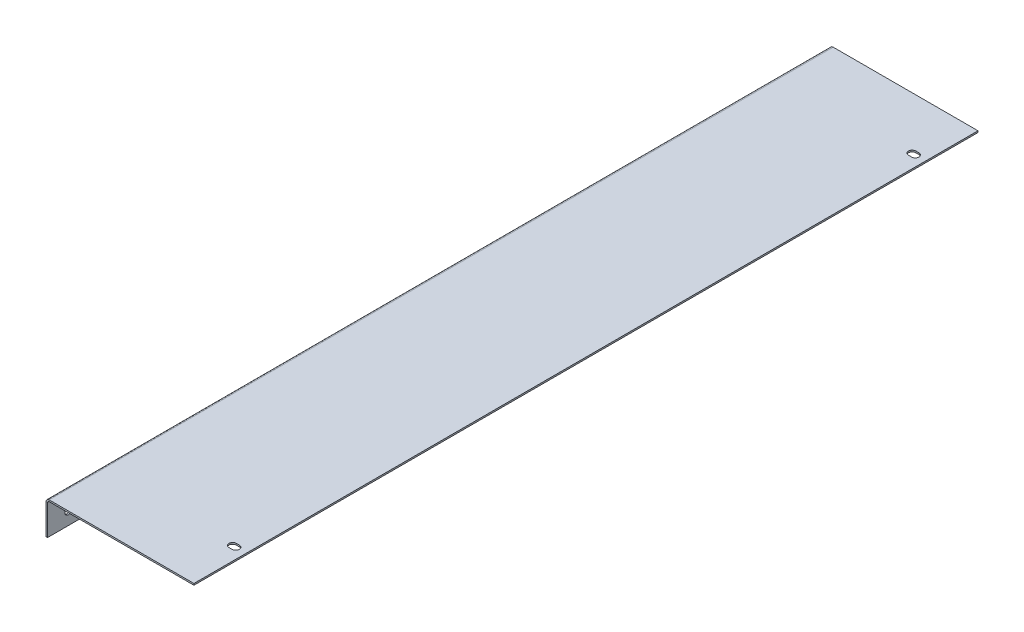
ISO-10303-21;
HEADER;
FILE_DESCRIPTION(('STEP AP214'),'2;1');
FILE_NAME('part.step','',(''),(''),'','','');
FILE_SCHEMA(('AUTOMOTIVE_DESIGN { 1 0 10303 214 1 1 1 1 }'));
ENDSEC;
DATA;
#1=APPLICATION_CONTEXT('core data for automotive mechanical design processes');
#2=APPLICATION_PROTOCOL_DEFINITION('international standard','automotive_design',2000,#1);
#3=PRODUCT_CONTEXT('',#1,'mechanical');
#4=PRODUCT('Part','Part','',(#3));
#5=PRODUCT_RELATED_PRODUCT_CATEGORY('part','',(#4));
#6=PRODUCT_DEFINITION_FORMATION('','',#4);
#7=PRODUCT_DEFINITION_CONTEXT('part definition',#1,'design');
#8=PRODUCT_DEFINITION('design','',#6,#7);
#9=PRODUCT_DEFINITION_SHAPE('','',#8);
#10=(LENGTH_UNIT() NAMED_UNIT(*) SI_UNIT(.MILLI.,.METRE.));
#11=(NAMED_UNIT(*) PLANE_ANGLE_UNIT() SI_UNIT($,.RADIAN.));
#12=(NAMED_UNIT(*) SI_UNIT($,.STERADIAN.) SOLID_ANGLE_UNIT());
#13=UNCERTAINTY_MEASURE_WITH_UNIT(LENGTH_MEASURE(1.E-05),#10,'distance_accuracy_value','');
#14=(GEOMETRIC_REPRESENTATION_CONTEXT(3) GLOBAL_UNCERTAINTY_ASSIGNED_CONTEXT((#13)) GLOBAL_UNIT_ASSIGNED_CONTEXT((#10,
#11,#12)) REPRESENTATION_CONTEXT('',''));
#15=CARTESIAN_POINT('',(0.,0.,0.));
#16=DIRECTION('',(0.,0.,1.));
#17=DIRECTION('',(1.,0.,0.));
#18=AXIS2_PLACEMENT_3D('',#15,#16,#17);
#19=CARTESIAN_POINT('',(0.,-1.5,375.));
#20=DIRECTION('',(0.,1.,0.));
#21=DIRECTION('',(0.,0.,1.));
#22=AXIS2_PLACEMENT_3D('',#19,#20,#21);
#23=PLANE('',#22);
#24=DIRECTION('',(1.,0.,0.));
#25=VECTOR('',#24,1.);
#26=CARTESIAN_POINT('',(0.,-1.5,-375.));
#27=LINE('',#26,#25);
#28=CARTESIAN_POINT('',(3.,-1.5,-375.));
#29=VERTEX_POINT('',#28);
#30=CARTESIAN_POINT('',(141.5,-1.5,-375.));
#31=VERTEX_POINT('',#30);
#32=EDGE_CURVE('E231',#29,#31,#27,.T.);
#33=ORIENTED_EDGE('',*,*,#32,.T.);
#34=DIRECTION('',(0.,0.,-1.));
#35=VECTOR('',#34,1.);
#36=CARTESIAN_POINT('',(141.5,-1.5,375.));
#37=LINE('',#36,#35);
#38=CARTESIAN_POINT('',(141.5,-1.5,375.));
#39=VERTEX_POINT('',#38);
#40=EDGE_CURVE('E298',#39,#31,#37,.T.);
#41=ORIENTED_EDGE('',*,*,#40,.F.);
#42=DIRECTION('',(1.,0.,0.));
#43=VECTOR('',#42,1.);
#44=CARTESIAN_POINT('',(0.,-1.5,375.));
#45=LINE('',#44,#43);
#46=CARTESIAN_POINT('',(3.,-1.5,375.));
#47=VERTEX_POINT('',#46);
#48=EDGE_CURVE('E234',#47,#39,#45,.T.);
#49=ORIENTED_EDGE('',*,*,#48,.F.);
#50=DIRECTION('',(0.,0.,-1.));
#51=VECTOR('',#50,1.);
#52=CARTESIAN_POINT('',(3.,-1.5,375.));
#53=LINE('',#52,#51);
#54=EDGE_CURVE('E258',#47,#29,#53,.T.);
#55=ORIENTED_EDGE('',*,*,#54,.T.);
#56=EDGE_LOOP('',(#33,#41,#49,#55));
#57=FACE_BOUND('',#56,.T.);
#58=DIRECTION('',(1.,0.,0.));
#59=VECTOR('',#58,1.);
#60=CARTESIAN_POINT('',(131.5,-1.5,328.5));
#61=LINE('',#60,#59);
#62=CARTESIAN_POINT('',(128.5,-1.5,328.5));
#63=VERTEX_POINT('',#62);
#64=CARTESIAN_POINT('',(131.5,-1.5,328.5));
#65=VERTEX_POINT('',#64);
#66=EDGE_CURVE('E206',#63,#65,#61,.T.);
#67=ORIENTED_EDGE('',*,*,#66,.T.);
#68=CARTESIAN_POINT('',(131.5,-1.5,325.));
#69=DIRECTION('',(0.,1.,0.));
#70=DIRECTION('',(0.,0.,1.));
#71=AXIS2_PLACEMENT_3D('',#68,#69,#70);
#72=CIRCLE('',#71,3.5);
#73=CARTESIAN_POINT('',(131.5,-1.5,321.5));
#74=VERTEX_POINT('',#73);
#75=EDGE_CURVE('E196',#65,#74,#72,.T.);
#76=ORIENTED_EDGE('',*,*,#75,.T.);
#77=DIRECTION('',(-1.,0.,0.));
#78=VECTOR('',#77,1.);
#79=CARTESIAN_POINT('',(131.5,-1.5,321.5));
#80=LINE('',#79,#78);
#81=CARTESIAN_POINT('',(128.5,-1.5,321.5));
#82=VERTEX_POINT('',#81);
#83=EDGE_CURVE('E199',#74,#82,#80,.T.);
#84=ORIENTED_EDGE('',*,*,#83,.T.);
#85=CARTESIAN_POINT('',(128.5,-1.5,325.));
#86=DIRECTION('',(0.,1.,0.));
#87=DIRECTION('',(0.,0.,1.));
#88=AXIS2_PLACEMENT_3D('',#85,#86,#87);
#89=CIRCLE('',#88,3.5);
#90=EDGE_CURVE('E203',#82,#63,#89,.T.);
#91=ORIENTED_EDGE('',*,*,#90,.T.);
#92=EDGE_LOOP('',(#67,#76,#84,#91));
#93=FACE_BOUND('',#92,.T.);
#94=CARTESIAN_POINT('',(131.5,-1.5,-325.));
#95=DIRECTION('',(0.,-1.,0.));
#96=DIRECTION('',(0.,0.,-1.));
#97=AXIS2_PLACEMENT_3D('',#94,#95,#96);
#98=CIRCLE('',#97,3.5);
#99=CARTESIAN_POINT('',(131.5,-1.5,-328.5));
#100=VERTEX_POINT('',#99);
#101=CARTESIAN_POINT('',(131.5,-1.5,-321.5));
#102=VERTEX_POINT('',#101);
#103=EDGE_CURVE('E164',#100,#102,#98,.T.);
#104=ORIENTED_EDGE('',*,*,#103,.F.);
#105=DIRECTION('',(1.,0.,0.));
#106=VECTOR('',#105,1.);
#107=CARTESIAN_POINT('',(131.5,-1.5,-328.5));
#108=LINE('',#107,#106);
#109=CARTESIAN_POINT('',(128.5,-1.5,-328.5));
#110=VERTEX_POINT('',#109);
#111=EDGE_CURVE('E156',#110,#100,#108,.T.);
#112=ORIENTED_EDGE('',*,*,#111,.F.);
#113=CARTESIAN_POINT('',(128.5,-1.5,-325.));
#114=DIRECTION('',(0.,-1.,0.));
#115=DIRECTION('',(0.,0.,-1.));
#116=AXIS2_PLACEMENT_3D('',#113,#114,#115);
#117=CIRCLE('',#116,3.5);
#118=CARTESIAN_POINT('',(128.5,-1.5,-321.5));
#119=VERTEX_POINT('',#118);
#120=EDGE_CURVE('E163',#119,#110,#117,.T.);
#121=ORIENTED_EDGE('',*,*,#120,.F.);
#122=DIRECTION('',(-1.,0.,0.));
#123=VECTOR('',#122,1.);
#124=CARTESIAN_POINT('',(131.5,-1.5,-321.5));
#125=LINE('',#124,#123);
#126=EDGE_CURVE('E168',#102,#119,#125,.T.);
#127=ORIENTED_EDGE('',*,*,#126,.F.);
#128=EDGE_LOOP('',(#104,#112,#121,#127));
#129=FACE_BOUND('',#128,.T.);
#130=ADVANCED_FACE('F44',(#57,#93,#129),#23,.F.);
#131=CARTESIAN_POINT('',(0.,0.,375.));
#132=DIRECTION('',(0.,1.,0.));
#133=DIRECTION('',(0.,0.,1.));
#134=AXIS2_PLACEMENT_3D('',#131,#132,#133);
#135=PLANE('',#134);
#136=CARTESIAN_POINT('',(131.5,0.,325.));
#137=DIRECTION('',(0.,1.,0.));
#138=DIRECTION('',(0.,0.,1.));
#139=AXIS2_PLACEMENT_3D('',#136,#137,#138);
#140=CIRCLE('',#139,3.5);
#141=CARTESIAN_POINT('',(131.5,0.,328.5));
#142=VERTEX_POINT('',#141);
#143=CARTESIAN_POINT('',(131.5,0.,321.5));
#144=VERTEX_POINT('',#143);
#145=EDGE_CURVE('E193',#142,#144,#140,.T.);
#146=ORIENTED_EDGE('',*,*,#145,.F.);
#147=DIRECTION('',(1.,0.,0.));
#148=VECTOR('',#147,1.);
#149=CARTESIAN_POINT('',(131.5,0.,328.5));
#150=LINE('',#149,#148);
#151=CARTESIAN_POINT('',(128.5,0.,328.5));
#152=VERTEX_POINT('',#151);
#153=EDGE_CURVE('E200',#152,#142,#150,.T.);
#154=ORIENTED_EDGE('',*,*,#153,.F.);
#155=CARTESIAN_POINT('',(128.5,0.,325.));
#156=DIRECTION('',(0.,1.,0.));
#157=DIRECTION('',(0.,0.,1.));
#158=AXIS2_PLACEMENT_3D('',#155,#156,#157);
#159=CIRCLE('',#158,3.5);
#160=CARTESIAN_POINT('',(128.5,0.,321.5));
#161=VERTEX_POINT('',#160);
#162=EDGE_CURVE('E214',#161,#152,#159,.T.);
#163=ORIENTED_EDGE('',*,*,#162,.F.);
#164=DIRECTION('',(-1.,0.,0.));
#165=VECTOR('',#164,1.);
#166=CARTESIAN_POINT('',(131.5,0.,321.5));
#167=LINE('',#166,#165);
#168=EDGE_CURVE('E211',#144,#161,#167,.T.);
#169=ORIENTED_EDGE('',*,*,#168,.F.);
#170=EDGE_LOOP('',(#146,#154,#163,#169));
#171=FACE_BOUND('',#170,.T.);
#172=DIRECTION('',(1.,0.,0.));
#173=VECTOR('',#172,1.);
#174=CARTESIAN_POINT('',(0.,0.,-375.));
#175=LINE('',#174,#173);
#176=CARTESIAN_POINT('',(3.,0.,-375.));
#177=VERTEX_POINT('',#176);
#178=CARTESIAN_POINT('',(141.5,0.,-375.));
#179=VERTEX_POINT('',#178);
#180=EDGE_CURVE('E264',#177,#179,#175,.T.);
#181=ORIENTED_EDGE('',*,*,#180,.F.);
#182=DIRECTION('',(0.,0.,-1.));
#183=VECTOR('',#182,1.);
#184=CARTESIAN_POINT('',(3.,0.,375.));
#185=LINE('',#184,#183);
#186=CARTESIAN_POINT('',(3.,0.,375.));
#187=VERTEX_POINT('',#186);
#188=EDGE_CURVE('E293',#187,#177,#185,.T.);
#189=ORIENTED_EDGE('',*,*,#188,.F.);
#190=DIRECTION('',(1.,0.,0.));
#191=VECTOR('',#190,1.);
#192=CARTESIAN_POINT('',(0.,0.,375.));
#193=LINE('',#192,#191);
#194=CARTESIAN_POINT('',(141.5,0.,375.));
#195=VERTEX_POINT('',#194);
#196=EDGE_CURVE('E240',#187,#195,#193,.T.);
#197=ORIENTED_EDGE('',*,*,#196,.T.);
#198=DIRECTION('',(0.,0.,-1.));
#199=VECTOR('',#198,1.);
#200=CARTESIAN_POINT('',(141.5,0.,375.));
#201=LINE('',#200,#199);
#202=EDGE_CURVE('E296',#195,#179,#201,.T.);
#203=ORIENTED_EDGE('',*,*,#202,.T.);
#204=EDGE_LOOP('',(#181,#189,#197,#203));
#205=FACE_BOUND('',#204,.T.);
#206=DIRECTION('',(1.,0.,0.));
#207=VECTOR('',#206,1.);
#208=CARTESIAN_POINT('',(131.5,0.,-328.5));
#209=LINE('',#208,#207);
#210=CARTESIAN_POINT('',(128.5,0.,-328.5));
#211=VERTEX_POINT('',#210);
#212=CARTESIAN_POINT('',(131.5,0.,-328.5));
#213=VERTEX_POINT('',#212);
#214=EDGE_CURVE('E180',#211,#213,#209,.T.);
#215=ORIENTED_EDGE('',*,*,#214,.T.);
#216=CARTESIAN_POINT('',(131.5,0.,-325.));
#217=DIRECTION('',(0.,-1.,0.));
#218=DIRECTION('',(0.,0.,-1.));
#219=AXIS2_PLACEMENT_3D('',#216,#217,#218);
#220=CIRCLE('',#219,3.5);
#221=CARTESIAN_POINT('',(131.5,0.,-321.5));
#222=VERTEX_POINT('',#221);
#223=EDGE_CURVE('E67',#213,#222,#220,.T.);
#224=ORIENTED_EDGE('',*,*,#223,.T.);
#225=DIRECTION('',(-1.,0.,0.));
#226=VECTOR('',#225,1.);
#227=CARTESIAN_POINT('',(131.5,0.,-321.5));
#228=LINE('',#227,#226);
#229=CARTESIAN_POINT('',(128.5,0.,-321.5));
#230=VERTEX_POINT('',#229);
#231=EDGE_CURVE('E171',#222,#230,#228,.T.);
#232=ORIENTED_EDGE('',*,*,#231,.T.);
#233=CARTESIAN_POINT('',(128.5,0.,-325.));
#234=DIRECTION('',(0.,-1.,0.));
#235=DIRECTION('',(0.,0.,-1.));
#236=AXIS2_PLACEMENT_3D('',#233,#234,#235);
#237=CIRCLE('',#236,3.5);
#238=EDGE_CURVE('E174',#230,#211,#237,.T.);
#239=ORIENTED_EDGE('',*,*,#238,.T.);
#240=EDGE_LOOP('',(#215,#224,#232,#239));
#241=FACE_BOUND('',#240,.T.);
#242=ADVANCED_FACE('F341',(#171,#205,#241),#135,.T.);
#243=CARTESIAN_POINT('',(3.,0.,375.));
#244=DIRECTION('',(0.,0.,1.));
#245=DIRECTION('',(1.,0.,0.));
#246=AXIS2_PLACEMENT_3D('',#243,#244,#245);
#247=PLANE('',#246);
#248=DIRECTION('',(0.,-1.,0.));
#249=VECTOR('',#248,1.);
#250=CARTESIAN_POINT('',(3.,0.,375.));
#251=LINE('',#250,#249);
#252=EDGE_CURVE('E11',#187,#47,#251,.T.);
#253=ORIENTED_EDGE('',*,*,#252,.F.);
#254=CARTESIAN_POINT('',(3.,-3.,375.));
#255=DIRECTION('',(0.,0.,1.));
#256=DIRECTION('',(1.,0.,0.));
#257=AXIS2_PLACEMENT_3D('',#254,#255,#256);
#258=CIRCLE('',#257,3.);
#259=CARTESIAN_POINT('',(0.,-3.,375.));
#260=VERTEX_POINT('',#259);
#261=EDGE_CURVE('E243',#260,#187,#258,.F.);
#262=ORIENTED_EDGE('',*,*,#261,.F.);
#263=DIRECTION('',(-1.,0.,0.));
#264=VECTOR('',#263,1.);
#265=CARTESIAN_POINT('',(1.5,-3.,375.));
#266=LINE('',#265,#264);
#267=CARTESIAN_POINT('',(1.5,-3.,375.));
#268=VERTEX_POINT('',#267);
#269=EDGE_CURVE('E52',#268,#260,#266,.T.);
#270=ORIENTED_EDGE('',*,*,#269,.F.);
#271=CARTESIAN_POINT('',(3.,-3.,375.));
#272=DIRECTION('',(0.,0.,1.));
#273=DIRECTION('',(1.,0.,0.));
#274=AXIS2_PLACEMENT_3D('',#271,#272,#273);
#275=CIRCLE('',#274,1.5);
#276=EDGE_CURVE('E255',#268,#47,#275,.F.);
#277=ORIENTED_EDGE('',*,*,#276,.T.);
#278=EDGE_LOOP('',(#253,#262,#270,#277));
#279=FACE_BOUND('',#278,.T.);
#280=ADVANCED_FACE('F46',(#279),#247,.T.);
#281=CARTESIAN_POINT('',(1.5,-3.,375.));
#282=DIRECTION('',(0.,0.,1.));
#283=DIRECTION('',(1.,0.,0.));
#284=AXIS2_PLACEMENT_3D('',#281,#282,#283);
#285=PLANE('',#284);
#286=ORIENTED_EDGE('',*,*,#196,.F.);
#287=ORIENTED_EDGE('',*,*,#252,.T.);
#288=ORIENTED_EDGE('',*,*,#48,.T.);
#289=DIRECTION('',(0.,-1.,0.));
#290=VECTOR('',#289,1.);
#291=CARTESIAN_POINT('',(141.5,0.,375.));
#292=LINE('',#291,#290);
#293=EDGE_CURVE('E236',#195,#39,#292,.T.);
#294=ORIENTED_EDGE('',*,*,#293,.F.);
#295=EDGE_LOOP('',(#286,#287,#288,#294));
#296=FACE_BOUND('',#295,.T.);
#297=ADVANCED_FACE('F338',(#296),#285,.T.);
#298=CARTESIAN_POINT('',(0.,-3.,-375.));
#299=DIRECTION('',(0.,0.,-1.));
#300=DIRECTION('',(-1.,0.,0.));
#301=AXIS2_PLACEMENT_3D('',#298,#299,#300);
#302=PLANE('',#301);
#303=DIRECTION('',(1.,0.,0.));
#304=VECTOR('',#303,1.);
#305=CARTESIAN_POINT('',(0.,-3.,-375.));
#306=LINE('',#305,#304);
#307=CARTESIAN_POINT('',(0.,-3.,-375.));
#308=VERTEX_POINT('',#307);
#309=CARTESIAN_POINT('',(1.5,-3.,-375.));
#310=VERTEX_POINT('',#309);
#311=EDGE_CURVE('E302',#308,#310,#306,.T.);
#312=ORIENTED_EDGE('',*,*,#311,.F.);
#313=CARTESIAN_POINT('',(3.,-3.,-375.));
#314=DIRECTION('',(0.,0.,1.));
#315=DIRECTION('',(1.,0.,0.));
#316=AXIS2_PLACEMENT_3D('',#313,#314,#315);
#317=CIRCLE('',#316,3.);
#318=EDGE_CURVE('E267',#308,#177,#317,.F.);
#319=ORIENTED_EDGE('',*,*,#318,.T.);
#320=DIRECTION('',(0.,1.,0.));
#321=VECTOR('',#320,1.);
#322=CARTESIAN_POINT('',(3.,-1.5,-375.));
#323=LINE('',#322,#321);
#324=EDGE_CURVE('E300',#29,#177,#323,.T.);
#325=ORIENTED_EDGE('',*,*,#324,.F.);
#326=CARTESIAN_POINT('',(3.,-3.,-375.));
#327=DIRECTION('',(0.,0.,1.));
#328=DIRECTION('',(1.,0.,0.));
#329=AXIS2_PLACEMENT_3D('',#326,#327,#328);
#330=CIRCLE('',#329,1.5);
#331=EDGE_CURVE('E237',#310,#29,#330,.F.);
#332=ORIENTED_EDGE('',*,*,#331,.F.);
#333=EDGE_LOOP('',(#312,#319,#325,#332));
#334=FACE_BOUND('',#333,.T.);
#335=ADVANCED_FACE('F346',(#334),#302,.T.);
#336=CARTESIAN_POINT('',(3.,-1.5,-375.));
#337=DIRECTION('',(0.,0.,-1.));
#338=DIRECTION('',(-1.,0.,0.));
#339=AXIS2_PLACEMENT_3D('',#336,#337,#338);
#340=PLANE('',#339);
#341=DIRECTION('',(0.,1.,0.));
#342=VECTOR('',#341,1.);
#343=CARTESIAN_POINT('',(0.,-32.,-375.));
#344=LINE('',#343,#342);
#345=CARTESIAN_POINT('',(0.,-32.,-375.));
#346=VERTEX_POINT('',#345);
#347=EDGE_CURVE('E270',#346,#308,#344,.T.);
#348=ORIENTED_EDGE('',*,*,#347,.T.);
#349=ORIENTED_EDGE('',*,*,#311,.T.);
#350=DIRECTION('',(0.,1.,0.));
#351=VECTOR('',#350,1.);
#352=CARTESIAN_POINT('',(1.5,-32.,-375.));
#353=LINE('',#352,#351);
#354=CARTESIAN_POINT('',(1.5,-32.,-375.));
#355=VERTEX_POINT('',#354);
#356=EDGE_CURVE('E276',#355,#310,#353,.T.);
#357=ORIENTED_EDGE('',*,*,#356,.F.);
#358=DIRECTION('',(-1.,0.,0.));
#359=VECTOR('',#358,1.);
#360=CARTESIAN_POINT('',(1.5,-32.,-375.));
#361=LINE('',#360,#359);
#362=EDGE_CURVE('E273',#355,#346,#361,.T.);
#363=ORIENTED_EDGE('',*,*,#362,.T.);
#364=EDGE_LOOP('',(#348,#349,#357,#363));
#365=FACE_BOUND('',#364,.T.);
#366=ADVANCED_FACE('F348',(#365),#340,.T.);
#367=CARTESIAN_POINT('',(141.5,0.,375.));
#368=DIRECTION('',(1.,0.,0.));
#369=DIRECTION('',(0.,0.,-1.));
#370=AXIS2_PLACEMENT_3D('',#367,#368,#369);
#371=PLANE('',#370);
#372=DIRECTION('',(0.,-1.,0.));
#373=VECTOR('',#372,1.);
#374=CARTESIAN_POINT('',(141.5,0.,-375.));
#375=LINE('',#374,#373);
#376=EDGE_CURVE('E261',#179,#31,#375,.T.);
#377=ORIENTED_EDGE('',*,*,#376,.F.);
#378=ORIENTED_EDGE('',*,*,#202,.F.);
#379=ORIENTED_EDGE('',*,*,#293,.T.);
#380=ORIENTED_EDGE('',*,*,#40,.T.);
#381=EDGE_LOOP('',(#377,#378,#379,#380));
#382=FACE_BOUND('',#381,.T.);
#383=ADVANCED_FACE('F350',(#382),#371,.T.);
#384=CARTESIAN_POINT('',(3.,-3.,375.));
#385=DIRECTION('',(0.,0.,-1.));
#386=DIRECTION('',(-1.,0.,0.));
#387=AXIS2_PLACEMENT_3D('',#384,#385,#386);
#388=CYLINDRICAL_SURFACE('',#387,3.);
#389=ORIENTED_EDGE('',*,*,#318,.F.);
#390=DIRECTION('',(0.,0.,-1.));
#391=VECTOR('',#390,1.);
#392=CARTESIAN_POINT('',(0.,-3.,375.));
#393=LINE('',#392,#391);
#394=EDGE_CURVE('E290',#260,#308,#393,.T.);
#395=ORIENTED_EDGE('',*,*,#394,.F.);
#396=ORIENTED_EDGE('',*,*,#261,.T.);
#397=ORIENTED_EDGE('',*,*,#188,.T.);
#398=EDGE_LOOP('',(#389,#395,#396,#397));
#399=FACE_BOUND('',#398,.T.);
#400=ADVANCED_FACE('F314',(#399),#388,.T.);
#401=CARTESIAN_POINT('',(0.,-32.,375.));
#402=DIRECTION('',(-1.,0.,0.));
#403=DIRECTION('',(0.,0.,1.));
#404=AXIS2_PLACEMENT_3D('',#401,#402,#403);
#405=PLANE('',#404);
#406=CARTESIAN_POINT('',(0.,-19.5,-355.));
#407=DIRECTION('',(1.,0.,0.));
#408=DIRECTION('',(0.,0.,-1.));
#409=AXIS2_PLACEMENT_3D('',#406,#407,#408);
#410=CIRCLE('',#409,3.50000000000002);
#411=CARTESIAN_POINT('',(0.,-19.5,-358.5));
#412=VERTEX_POINT('',#411);
#413=EDGE_CURVE('E186',#412,#412,#410,.T.);
#414=ORIENTED_EDGE('',*,*,#413,.T.);
#415=EDGE_LOOP('',(#414));
#416=FACE_BOUND('',#415,.T.);
#417=CARTESIAN_POINT('',(0.,-19.5,355.));
#418=DIRECTION('',(-1.,0.,0.));
#419=DIRECTION('',(0.,0.,1.));
#420=AXIS2_PLACEMENT_3D('',#417,#418,#419);
#421=CIRCLE('',#420,3.50000000000002);
#422=CARTESIAN_POINT('',(0.,-19.5,358.5));
#423=VERTEX_POINT('',#422);
#424=EDGE_CURVE('E221',#423,#423,#421,.T.);
#425=ORIENTED_EDGE('',*,*,#424,.F.);
#426=EDGE_LOOP('',(#425));
#427=FACE_BOUND('',#426,.T.);
#428=ORIENTED_EDGE('',*,*,#347,.F.);
#429=DIRECTION('',(0.,0.,-1.));
#430=VECTOR('',#429,1.);
#431=CARTESIAN_POINT('',(0.,-32.,375.));
#432=LINE('',#431,#430);
#433=CARTESIAN_POINT('',(0.,-32.,375.));
#434=VERTEX_POINT('',#433);
#435=EDGE_CURVE('E288',#434,#346,#432,.T.);
#436=ORIENTED_EDGE('',*,*,#435,.F.);
#437=DIRECTION('',(0.,1.,0.));
#438=VECTOR('',#437,1.);
#439=CARTESIAN_POINT('',(0.,-32.,375.));
#440=LINE('',#439,#438);
#441=EDGE_CURVE('E246',#434,#260,#440,.T.);
#442=ORIENTED_EDGE('',*,*,#441,.T.);
#443=ORIENTED_EDGE('',*,*,#394,.T.);
#444=EDGE_LOOP('',(#428,#436,#442,#443));
#445=FACE_BOUND('',#444,.T.);
#446=ADVANCED_FACE('F318',(#416,#427,#445),#405,.T.);
#447=CARTESIAN_POINT('',(1.5,-32.,375.));
#448=DIRECTION('',(0.,-1.,0.));
#449=DIRECTION('',(0.,0.,-1.));
#450=AXIS2_PLACEMENT_3D('',#447,#448,#449);
#451=PLANE('',#450);
#452=ORIENTED_EDGE('',*,*,#362,.F.);
#453=DIRECTION('',(0.,0.,-1.));
#454=VECTOR('',#453,1.);
#455=CARTESIAN_POINT('',(1.5,-32.,375.));
#456=LINE('',#455,#454);
#457=CARTESIAN_POINT('',(1.5,-32.,375.));
#458=VERTEX_POINT('',#457);
#459=EDGE_CURVE('E286',#458,#355,#456,.T.);
#460=ORIENTED_EDGE('',*,*,#459,.F.);
#461=DIRECTION('',(-1.,0.,0.));
#462=VECTOR('',#461,1.);
#463=CARTESIAN_POINT('',(1.5,-32.,375.));
#464=LINE('',#463,#462);
#465=EDGE_CURVE('E249',#458,#434,#464,.T.);
#466=ORIENTED_EDGE('',*,*,#465,.T.);
#467=ORIENTED_EDGE('',*,*,#435,.T.);
#468=EDGE_LOOP('',(#452,#460,#466,#467));
#469=FACE_BOUND('',#468,.T.);
#470=ADVANCED_FACE('F321',(#469),#451,.T.);
#471=CARTESIAN_POINT('',(1.5,-32.,375.));
#472=DIRECTION('',(-1.,0.,0.));
#473=DIRECTION('',(0.,0.,1.));
#474=AXIS2_PLACEMENT_3D('',#471,#472,#473);
#475=PLANE('',#474);
#476=CARTESIAN_POINT('',(1.5,-19.5,-355.));
#477=DIRECTION('',(1.,0.,0.));
#478=DIRECTION('',(0.,0.,-1.));
#479=AXIS2_PLACEMENT_3D('',#476,#477,#478);
#480=CIRCLE('',#479,3.50000000000002);
#481=CARTESIAN_POINT('',(1.5,-19.5,-358.5));
#482=VERTEX_POINT('',#481);
#483=EDGE_CURVE('E190',#482,#482,#480,.T.);
#484=ORIENTED_EDGE('',*,*,#483,.F.);
#485=EDGE_LOOP('',(#484));
#486=FACE_BOUND('',#485,.T.);
#487=CARTESIAN_POINT('',(1.5,-19.5,355.));
#488=DIRECTION('',(-1.,0.,0.));
#489=DIRECTION('',(0.,0.,1.));
#490=AXIS2_PLACEMENT_3D('',#487,#488,#489);
#491=CIRCLE('',#490,3.50000000000002);
#492=CARTESIAN_POINT('',(1.5,-19.5,358.5));
#493=VERTEX_POINT('',#492);
#494=EDGE_CURVE('E228',#493,#493,#491,.T.);
#495=ORIENTED_EDGE('',*,*,#494,.T.);
#496=EDGE_LOOP('',(#495));
#497=FACE_BOUND('',#496,.T.);
#498=ORIENTED_EDGE('',*,*,#356,.T.);
#499=DIRECTION('',(0.,0.,-1.));
#500=VECTOR('',#499,1.);
#501=CARTESIAN_POINT('',(1.5,-3.,375.));
#502=LINE('',#501,#500);
#503=EDGE_CURVE('E283',#268,#310,#502,.T.);
#504=ORIENTED_EDGE('',*,*,#503,.F.);
#505=DIRECTION('',(0.,1.,0.));
#506=VECTOR('',#505,1.);
#507=CARTESIAN_POINT('',(1.5,-32.,375.));
#508=LINE('',#507,#506);
#509=EDGE_CURVE('E252',#458,#268,#508,.T.);
#510=ORIENTED_EDGE('',*,*,#509,.F.);
#511=ORIENTED_EDGE('',*,*,#459,.T.);
#512=EDGE_LOOP('',(#498,#504,#510,#511));
#513=FACE_BOUND('',#512,.T.);
#514=ADVANCED_FACE('F324',(#486,#497,#513),#475,.F.);
#515=CARTESIAN_POINT('',(3.,-3.,375.));
#516=DIRECTION('',(0.,0.,-1.));
#517=DIRECTION('',(-1.,0.,0.));
#518=AXIS2_PLACEMENT_3D('',#515,#516,#517);
#519=CYLINDRICAL_SURFACE('',#518,1.5);
#520=ORIENTED_EDGE('',*,*,#331,.T.);
#521=ORIENTED_EDGE('',*,*,#54,.F.);
#522=ORIENTED_EDGE('',*,*,#276,.F.);
#523=ORIENTED_EDGE('',*,*,#503,.T.);
#524=EDGE_LOOP('',(#520,#521,#522,#523));
#525=FACE_BOUND('',#524,.T.);
#526=ADVANCED_FACE('F329',(#525),#519,.F.);
#527=CARTESIAN_POINT('',(3.,-3.,375.));
#528=DIRECTION('',(0.,0.,1.));
#529=DIRECTION('',(1.,0.,0.));
#530=AXIS2_PLACEMENT_3D('',#527,#528,#529);
#531=PLANE('',#530);
#532=ORIENTED_EDGE('',*,*,#509,.T.);
#533=ORIENTED_EDGE('',*,*,#269,.T.);
#534=ORIENTED_EDGE('',*,*,#441,.F.);
#535=ORIENTED_EDGE('',*,*,#465,.F.);
#536=EDGE_LOOP('',(#532,#533,#534,#535));
#537=FACE_BOUND('',#536,.T.);
#538=ADVANCED_FACE('F306',(#537),#531,.T.);
#539=CARTESIAN_POINT('',(3.,-3.,-375.));
#540=DIRECTION('',(0.,0.,1.));
#541=DIRECTION('',(1.,0.,0.));
#542=AXIS2_PLACEMENT_3D('',#539,#540,#541);
#543=PLANE('',#542);
#544=ORIENTED_EDGE('',*,*,#32,.F.);
#545=ORIENTED_EDGE('',*,*,#324,.T.);
#546=ORIENTED_EDGE('',*,*,#180,.T.);
#547=ORIENTED_EDGE('',*,*,#376,.T.);
#548=EDGE_LOOP('',(#544,#545,#546,#547));
#549=FACE_BOUND('',#548,.T.);
#550=ADVANCED_FACE('F380',(#549),#543,.F.);
#551=CARTESIAN_POINT('',(1.5,-19.5,355.));
#552=DIRECTION('',(-1.,0.,0.));
#553=DIRECTION('',(0.,0.,1.));
#554=AXIS2_PLACEMENT_3D('',#551,#552,#553);
#555=CYLINDRICAL_SURFACE('',#554,3.50000000000002);
#556=ORIENTED_EDGE('',*,*,#494,.F.);
#557=EDGE_LOOP('',(#556));
#558=FACE_BOUND('',#557,.T.);
#559=ORIENTED_EDGE('',*,*,#424,.T.);
#560=EDGE_LOOP('',(#559));
#561=FACE_BOUND('',#560,.T.);
#562=ADVANCED_FACE('F383',(#558,#561),#555,.F.);
#563=CARTESIAN_POINT('',(131.5,-1.5,325.));
#564=DIRECTION('',(0.,1.,0.));
#565=DIRECTION('',(0.,0.,1.));
#566=AXIS2_PLACEMENT_3D('',#563,#564,#565);
#567=CYLINDRICAL_SURFACE('',#566,3.5);
#568=ORIENTED_EDGE('',*,*,#145,.T.);
#569=DIRECTION('',(0.,1.,0.));
#570=VECTOR('',#569,1.);
#571=CARTESIAN_POINT('',(131.5,-1.5,321.5));
#572=LINE('',#571,#570);
#573=EDGE_CURVE('E209',#74,#144,#572,.T.);
#574=ORIENTED_EDGE('',*,*,#573,.F.);
#575=ORIENTED_EDGE('',*,*,#75,.F.);
#576=DIRECTION('',(0.,1.,0.));
#577=VECTOR('',#576,1.);
#578=CARTESIAN_POINT('',(131.5,-1.5,328.5));
#579=LINE('',#578,#577);
#580=EDGE_CURVE('E219',#65,#142,#579,.T.);
#581=ORIENTED_EDGE('',*,*,#580,.T.);
#582=EDGE_LOOP('',(#568,#574,#575,#581));
#583=FACE_BOUND('',#582,.T.);
#584=ADVANCED_FACE('F388',(#583),#567,.F.);
#585=CARTESIAN_POINT('',(131.5,-1.5,328.5));
#586=DIRECTION('',(0.,0.,1.));
#587=DIRECTION('',(1.,0.,0.));
#588=AXIS2_PLACEMENT_3D('',#585,#586,#587);
#589=PLANE('',#588);
#590=ORIENTED_EDGE('',*,*,#153,.T.);
#591=ORIENTED_EDGE('',*,*,#580,.F.);
#592=ORIENTED_EDGE('',*,*,#66,.F.);
#593=DIRECTION('',(0.,1.,0.));
#594=VECTOR('',#593,1.);
#595=CARTESIAN_POINT('',(128.5,-1.5,328.5));
#596=LINE('',#595,#594);
#597=EDGE_CURVE('E222',#63,#152,#596,.T.);
#598=ORIENTED_EDGE('',*,*,#597,.T.);
#599=EDGE_LOOP('',(#590,#591,#592,#598));
#600=FACE_BOUND('',#599,.T.);
#601=ADVANCED_FACE('F392',(#600),#589,.F.);
#602=CARTESIAN_POINT('',(128.5,-1.5,325.));
#603=DIRECTION('',(0.,1.,0.));
#604=DIRECTION('',(0.,0.,1.));
#605=AXIS2_PLACEMENT_3D('',#602,#603,#604);
#606=CYLINDRICAL_SURFACE('',#605,3.5);
#607=ORIENTED_EDGE('',*,*,#162,.T.);
#608=ORIENTED_EDGE('',*,*,#597,.F.);
#609=ORIENTED_EDGE('',*,*,#90,.F.);
#610=DIRECTION('',(0.,1.,0.));
#611=VECTOR('',#610,1.);
#612=CARTESIAN_POINT('',(128.5,-1.5,321.5));
#613=LINE('',#612,#611);
#614=EDGE_CURVE('E224',#82,#161,#613,.T.);
#615=ORIENTED_EDGE('',*,*,#614,.T.);
#616=EDGE_LOOP('',(#607,#608,#609,#615));
#617=FACE_BOUND('',#616,.T.);
#618=ADVANCED_FACE('F397',(#617),#606,.F.);
#619=CARTESIAN_POINT('',(131.5,-1.5,321.5));
#620=DIRECTION('',(0.,0.,-1.));
#621=DIRECTION('',(-1.,0.,0.));
#622=AXIS2_PLACEMENT_3D('',#619,#620,#621);
#623=PLANE('',#622);
#624=ORIENTED_EDGE('',*,*,#168,.T.);
#625=ORIENTED_EDGE('',*,*,#614,.F.);
#626=ORIENTED_EDGE('',*,*,#83,.F.);
#627=ORIENTED_EDGE('',*,*,#573,.T.);
#628=EDGE_LOOP('',(#624,#625,#626,#627));
#629=FACE_BOUND('',#628,.T.);
#630=ADVANCED_FACE('F394',(#629),#623,.F.);
#631=CARTESIAN_POINT('',(1.5,-19.5,-355.));
#632=DIRECTION('',(-1.,0.,0.));
#633=DIRECTION('',(0.,0.,1.));
#634=AXIS2_PLACEMENT_3D('',#631,#632,#633);
#635=CYLINDRICAL_SURFACE('',#634,3.50000000000002);
#636=ORIENTED_EDGE('',*,*,#483,.T.);
#637=EDGE_LOOP('',(#636));
#638=FACE_BOUND('',#637,.T.);
#639=ORIENTED_EDGE('',*,*,#413,.F.);
#640=EDGE_LOOP('',(#639));
#641=FACE_BOUND('',#640,.T.);
#642=ADVANCED_FACE('F396',(#638,#641),#635,.F.);
#643=CARTESIAN_POINT('',(131.5,-1.5,-325.));
#644=DIRECTION('',(0.,1.,0.));
#645=DIRECTION('',(0.,0.,1.));
#646=AXIS2_PLACEMENT_3D('',#643,#644,#645);
#647=CYLINDRICAL_SURFACE('',#646,3.5);
#648=ORIENTED_EDGE('',*,*,#223,.F.);
#649=DIRECTION('',(0.,1.,0.));
#650=VECTOR('',#649,1.);
#651=CARTESIAN_POINT('',(131.5,-1.5,-328.5));
#652=LINE('',#651,#650);
#653=EDGE_CURVE('E158',#100,#213,#652,.T.);
#654=ORIENTED_EDGE('',*,*,#653,.F.);
#655=ORIENTED_EDGE('',*,*,#103,.T.);
#656=DIRECTION('',(0.,1.,0.));
#657=VECTOR('',#656,1.);
#658=CARTESIAN_POINT('',(131.5,-1.5,-321.5));
#659=LINE('',#658,#657);
#660=EDGE_CURVE('E184',#102,#222,#659,.T.);
#661=ORIENTED_EDGE('',*,*,#660,.T.);
#662=EDGE_LOOP('',(#648,#654,#655,#661));
#663=FACE_BOUND('',#662,.T.);
#664=ADVANCED_FACE('F166',(#663),#647,.F.);
#665=CARTESIAN_POINT('',(131.5,-1.5,-321.5));
#666=DIRECTION('',(0.,0.,-1.));
#667=DIRECTION('',(-1.,0.,0.));
#668=AXIS2_PLACEMENT_3D('',#665,#666,#667);
#669=PLANE('',#668);
#670=ORIENTED_EDGE('',*,*,#231,.F.);
#671=ORIENTED_EDGE('',*,*,#660,.F.);
#672=ORIENTED_EDGE('',*,*,#126,.T.);
#673=DIRECTION('',(0.,1.,0.));
#674=VECTOR('',#673,1.);
#675=CARTESIAN_POINT('',(128.5,-1.5,-321.5));
#676=LINE('',#675,#674);
#677=EDGE_CURVE('E187',#119,#230,#676,.T.);
#678=ORIENTED_EDGE('',*,*,#677,.T.);
#679=EDGE_LOOP('',(#670,#671,#672,#678));
#680=FACE_BOUND('',#679,.T.);
#681=ADVANCED_FACE('F410',(#680),#669,.T.);
#682=CARTESIAN_POINT('',(128.5,-1.5,-325.));
#683=DIRECTION('',(0.,1.,0.));
#684=DIRECTION('',(0.,0.,1.));
#685=AXIS2_PLACEMENT_3D('',#682,#683,#684);
#686=CYLINDRICAL_SURFACE('',#685,3.5);
#687=ORIENTED_EDGE('',*,*,#238,.F.);
#688=ORIENTED_EDGE('',*,*,#677,.F.);
#689=ORIENTED_EDGE('',*,*,#120,.T.);
#690=DIRECTION('',(0.,1.,0.));
#691=VECTOR('',#690,1.);
#692=CARTESIAN_POINT('',(128.5,-1.5,-328.5));
#693=LINE('',#692,#691);
#694=EDGE_CURVE('E59',#110,#211,#693,.T.);
#695=ORIENTED_EDGE('',*,*,#694,.T.);
#696=EDGE_LOOP('',(#687,#688,#689,#695));
#697=FACE_BOUND('',#696,.T.);
#698=ADVANCED_FACE('F413',(#697),#686,.F.);
#699=CARTESIAN_POINT('',(131.5,-1.5,-328.5));
#700=DIRECTION('',(0.,0.,1.));
#701=DIRECTION('',(1.,0.,0.));
#702=AXIS2_PLACEMENT_3D('',#699,#700,#701);
#703=PLANE('',#702);
#704=ORIENTED_EDGE('',*,*,#214,.F.);
#705=ORIENTED_EDGE('',*,*,#694,.F.);
#706=ORIENTED_EDGE('',*,*,#111,.T.);
#707=ORIENTED_EDGE('',*,*,#653,.T.);
#708=EDGE_LOOP('',(#704,#705,#706,#707));
#709=FACE_BOUND('',#708,.T.);
#710=ADVANCED_FACE('F157',(#709),#703,.T.);
#711=CLOSED_SHELL('',(#130,#242,#280,#297,#335,#366,#383,#400,#446,#470,#514,#526,#538,#550,
#562,#584,#601,#618,#630,#642,#664,#681,#698,#710));
#712=MANIFOLD_SOLID_BREP('B2',#711);
#713=ADVANCED_BREP_SHAPE_REPRESENTATION('',(#18,#712),#14);
#714=SHAPE_DEFINITION_REPRESENTATION(#9,#713);
ENDSEC;
END-ISO-10303-21;
